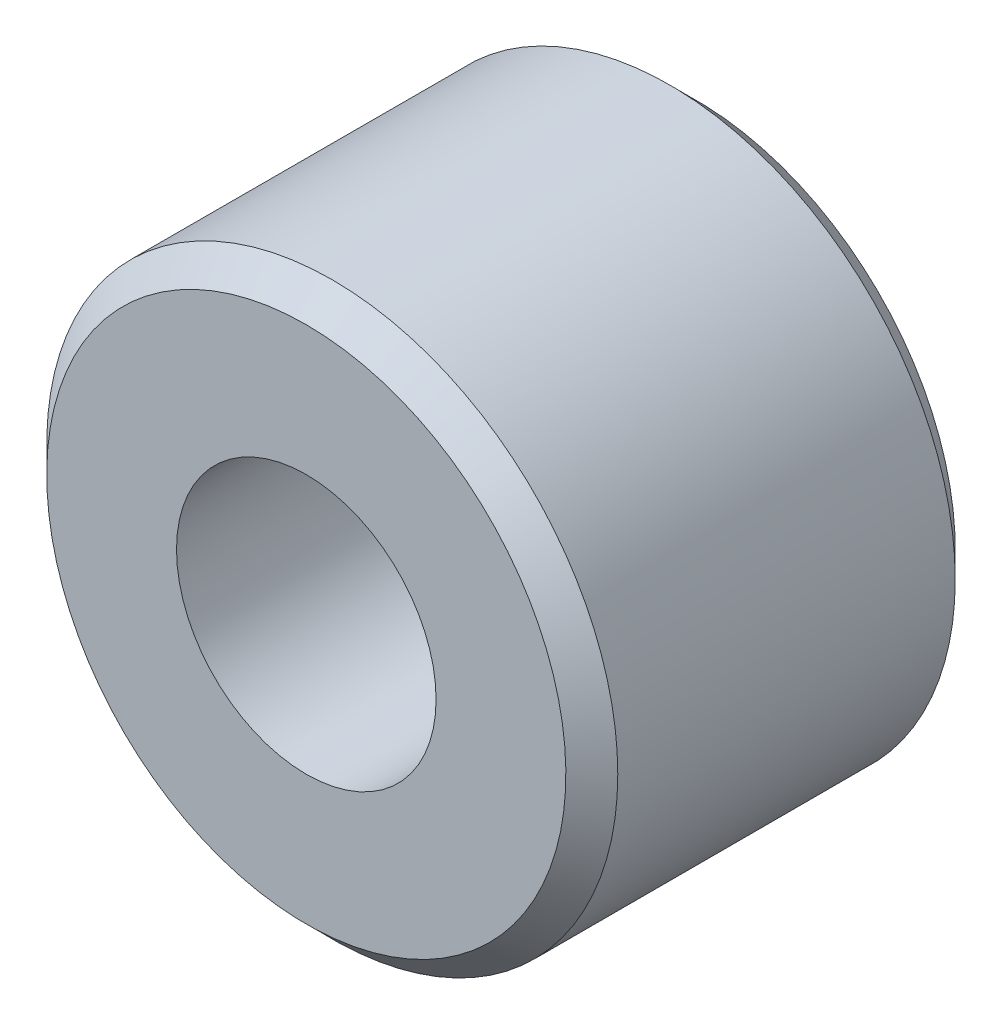
ISO-10303-21;
HEADER;
FILE_DESCRIPTION(('STEP AP214'),'2;1');
FILE_NAME('part.step','',(''),(''),'','','');
FILE_SCHEMA(('AUTOMOTIVE_DESIGN { 1 0 10303 214 1 1 1 1 }'));
ENDSEC;
DATA;
#1=APPLICATION_CONTEXT('core data for automotive mechanical design processes');
#2=APPLICATION_PROTOCOL_DEFINITION('international standard','automotive_design',2000,#1);
#3=PRODUCT_CONTEXT('',#1,'mechanical');
#4=PRODUCT('Part','Part','',(#3));
#5=PRODUCT_RELATED_PRODUCT_CATEGORY('part','',(#4));
#6=PRODUCT_DEFINITION_FORMATION('','',#4);
#7=PRODUCT_DEFINITION_CONTEXT('part definition',#1,'design');
#8=PRODUCT_DEFINITION('design','',#6,#7);
#9=PRODUCT_DEFINITION_SHAPE('','',#8);
#10=(LENGTH_UNIT() NAMED_UNIT(*) SI_UNIT(.MILLI.,.METRE.));
#11=(NAMED_UNIT(*) PLANE_ANGLE_UNIT() SI_UNIT($,.RADIAN.));
#12=(NAMED_UNIT(*) SI_UNIT($,.STERADIAN.) SOLID_ANGLE_UNIT());
#13=UNCERTAINTY_MEASURE_WITH_UNIT(LENGTH_MEASURE(1.E-05),#10,'distance_accuracy_value','');
#14=(GEOMETRIC_REPRESENTATION_CONTEXT(3) GLOBAL_UNCERTAINTY_ASSIGNED_CONTEXT((#13)) GLOBAL_UNIT_ASSIGNED_CONTEXT((#10,
#11,#12)) REPRESENTATION_CONTEXT('',''));
#15=CARTESIAN_POINT('',(0.,0.,0.));
#16=DIRECTION('',(0.,0.,1.));
#17=DIRECTION('',(1.,0.,0.));
#18=AXIS2_PLACEMENT_3D('',#15,#16,#17);
#19=CARTESIAN_POINT('',(0.,0.,7.5));
#20=DIRECTION('',(0.,0.,1.));
#21=DIRECTION('',(1.,0.,0.));
#22=AXIS2_PLACEMENT_3D('',#19,#20,#21);
#23=CYLINDRICAL_SURFACE('',#22,5.);
#24=CARTESIAN_POINT('',(0.,0.,15.));
#25=DIRECTION('',(0.,0.,1.));
#26=DIRECTION('',(1.,0.,0.));
#27=AXIS2_PLACEMENT_3D('',#24,#25,#26);
#28=CIRCLE('',#27,5.);
#29=CARTESIAN_POINT('',(5.,0.,15.));
#30=VERTEX_POINT('',#29);
#31=EDGE_CURVE('E17',#30,#30,#28,.F.);
#32=ORIENTED_EDGE('',*,*,#31,.F.);
#33=EDGE_LOOP('',(#32));
#34=FACE_BOUND('',#33,.T.);
#35=CARTESIAN_POINT('',(0.,0.,0.));
#36=DIRECTION('',(0.,0.,1.));
#37=DIRECTION('',(1.,0.,0.));
#38=AXIS2_PLACEMENT_3D('',#35,#36,#37);
#39=CIRCLE('',#38,5.);
#40=CARTESIAN_POINT('',(5.,0.,0.));
#41=VERTEX_POINT('',#40);
#42=EDGE_CURVE('E33',#41,#41,#39,.T.);
#43=ORIENTED_EDGE('',*,*,#42,.F.);
#44=EDGE_LOOP('',(#43));
#45=FACE_BOUND('',#44,.T.);
#46=ADVANCED_FACE('F14',(#34,#45),#23,.F.);
#47=CARTESIAN_POINT('',(7.5,0.,15.));
#48=DIRECTION('',(0.,0.,1.));
#49=DIRECTION('',(1.,0.,0.));
#50=AXIS2_PLACEMENT_3D('',#47,#48,#49);
#51=PLANE('',#50);
#52=ORIENTED_EDGE('',*,*,#31,.T.);
#53=EDGE_LOOP('',(#52));
#54=FACE_BOUND('',#53,.T.);
#55=CARTESIAN_POINT('',(0.,0.,15.));
#56=DIRECTION('',(0.,0.,-1.));
#57=DIRECTION('',(0.,1.,0.));
#58=AXIS2_PLACEMENT_3D('',#55,#56,#57);
#59=CIRCLE('',#58,10.);
#60=CARTESIAN_POINT('',(0.,10.,15.));
#61=VERTEX_POINT('',#60);
#62=EDGE_CURVE('E31',#61,#61,#59,.T.);
#63=ORIENTED_EDGE('',*,*,#62,.F.);
#64=EDGE_LOOP('',(#63));
#65=FACE_BOUND('',#64,.T.);
#66=ADVANCED_FACE('F40',(#54,#65),#51,.T.);
#67=CARTESIAN_POINT('',(7.5,0.,0.));
#68=DIRECTION('',(0.,0.,-1.));
#69=DIRECTION('',(-1.,0.,0.));
#70=AXIS2_PLACEMENT_3D('',#67,#68,#69);
#71=PLANE('',#70);
#72=CARTESIAN_POINT('',(0.,0.,0.));
#73=DIRECTION('',(0.,0.,1.));
#74=DIRECTION('',(0.,-1.,0.));
#75=AXIS2_PLACEMENT_3D('',#72,#73,#74);
#76=CIRCLE('',#75,10.);
#77=CARTESIAN_POINT('',(0.,-10.,0.));
#78=VERTEX_POINT('',#77);
#79=EDGE_CURVE('E26',#78,#78,#76,.T.);
#80=ORIENTED_EDGE('',*,*,#79,.F.);
#81=EDGE_LOOP('',(#80));
#82=FACE_BOUND('',#81,.T.);
#83=ORIENTED_EDGE('',*,*,#42,.T.);
#84=EDGE_LOOP('',(#83));
#85=FACE_BOUND('',#84,.T.);
#86=ADVANCED_FACE('F49',(#82,#85),#71,.T.);
#87=CARTESIAN_POINT('',(0.,0.,14.));
#88=DIRECTION('',(0.,0.,-1.));
#89=DIRECTION('',(0.,1.,0.));
#90=AXIS2_PLACEMENT_3D('',#87,#88,#89);
#91=CONICAL_SURFACE('',#90,11.,0.785398163397448);
#92=ORIENTED_EDGE('',*,*,#62,.T.);
#93=EDGE_LOOP('',(#92));
#94=FACE_BOUND('',#93,.T.);
#95=CARTESIAN_POINT('',(0.,0.,14.));
#96=DIRECTION('',(0.,0.,1.));
#97=DIRECTION('',(1.,0.,0.));
#98=AXIS2_PLACEMENT_3D('',#95,#96,#97);
#99=CIRCLE('',#98,11.);
#100=CARTESIAN_POINT('',(11.,0.,14.));
#101=VERTEX_POINT('',#100);
#102=EDGE_CURVE('E21',#101,#101,#99,.F.);
#103=ORIENTED_EDGE('',*,*,#102,.F.);
#104=EDGE_LOOP('',(#103));
#105=FACE_BOUND('',#104,.T.);
#106=ADVANCED_FACE('F58',(#94,#105),#91,.T.);
#107=CARTESIAN_POINT('',(0.,0.,0.999999999999999));
#108=DIRECTION('',(0.,0.,1.));
#109=DIRECTION('',(0.,-1.,0.));
#110=AXIS2_PLACEMENT_3D('',#107,#108,#109);
#111=CONICAL_SURFACE('',#110,11.,0.785398163397448);
#112=ORIENTED_EDGE('',*,*,#79,.T.);
#113=EDGE_LOOP('',(#112));
#114=FACE_BOUND('',#113,.T.);
#115=CARTESIAN_POINT('',(0.,0.,1.));
#116=DIRECTION('',(0.,0.,1.));
#117=DIRECTION('',(1.,0.,0.));
#118=AXIS2_PLACEMENT_3D('',#115,#116,#117);
#119=CIRCLE('',#118,11.);
#120=CARTESIAN_POINT('',(11.,0.,1.));
#121=VERTEX_POINT('',#120);
#122=EDGE_CURVE('E10',#121,#121,#119,.T.);
#123=ORIENTED_EDGE('',*,*,#122,.F.);
#124=EDGE_LOOP('',(#123));
#125=FACE_BOUND('',#124,.T.);
#126=ADVANCED_FACE('F52',(#114,#125),#111,.T.);
#127=CARTESIAN_POINT('',(0.,0.,7.5));
#128=DIRECTION('',(0.,0.,1.));
#129=DIRECTION('',(1.,0.,0.));
#130=AXIS2_PLACEMENT_3D('',#127,#128,#129);
#131=CYLINDRICAL_SURFACE('',#130,11.);
#132=ORIENTED_EDGE('',*,*,#102,.T.);
#133=EDGE_LOOP('',(#132));
#134=FACE_BOUND('',#133,.T.);
#135=ORIENTED_EDGE('',*,*,#122,.T.);
#136=EDGE_LOOP('',(#135));
#137=FACE_BOUND('',#136,.T.);
#138=ADVANCED_FACE('F50',(#134,#137),#131,.T.);
#139=CLOSED_SHELL('',(#46,#66,#86,#106,#126,#138));
#140=MANIFOLD_SOLID_BREP('B1',#139);
#141=ADVANCED_BREP_SHAPE_REPRESENTATION('',(#18,#140),#14);
#142=SHAPE_DEFINITION_REPRESENTATION(#9,#141);
ENDSEC;
END-ISO-10303-21;
